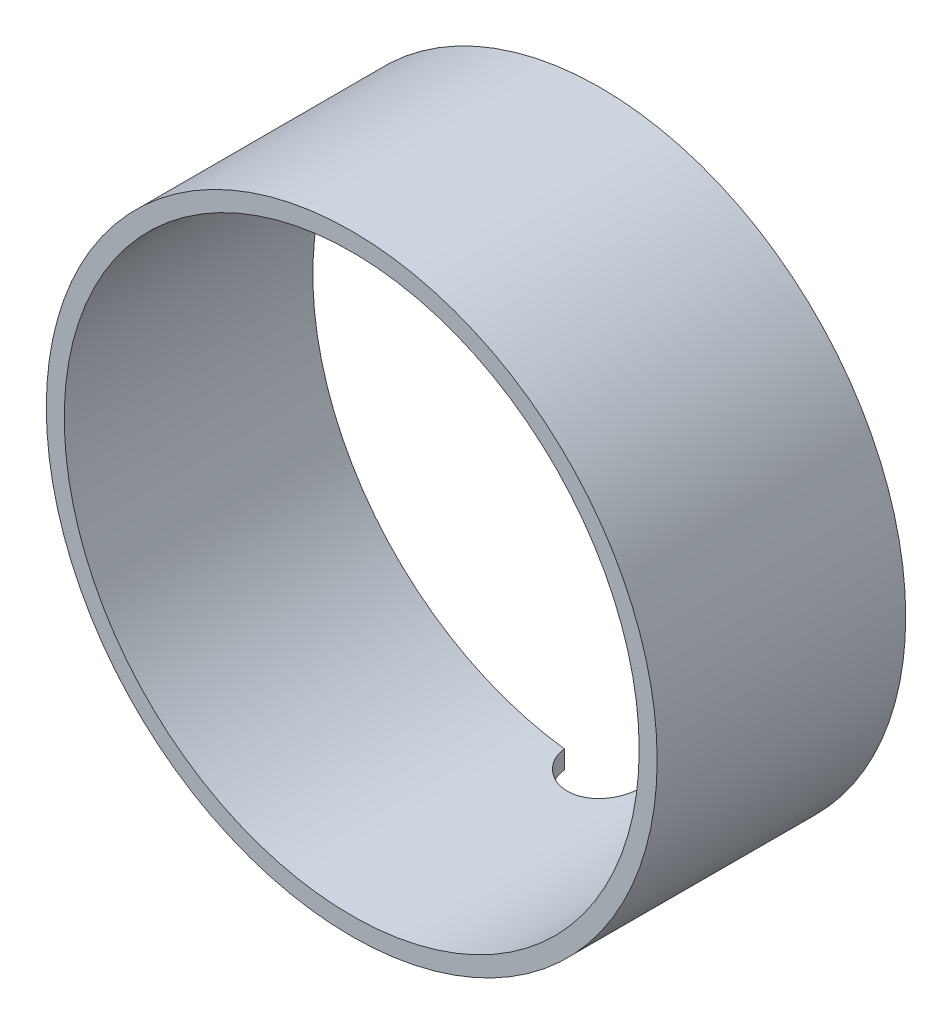
ISO-10303-21;
HEADER;
FILE_DESCRIPTION(('STEP AP214'),'2;1');
FILE_NAME('part.step','',(''),(''),'','','');
FILE_SCHEMA(('AUTOMOTIVE_DESIGN { 1 0 10303 214 1 1 1 1 }'));
ENDSEC;
DATA;
#1=APPLICATION_CONTEXT('core data for automotive mechanical design processes');
#2=APPLICATION_PROTOCOL_DEFINITION('international standard','automotive_design',2000,#1);
#3=PRODUCT_CONTEXT('',#1,'mechanical');
#4=PRODUCT('Part','Part','',(#3));
#5=PRODUCT_RELATED_PRODUCT_CATEGORY('part','',(#4));
#6=PRODUCT_DEFINITION_FORMATION('','',#4);
#7=PRODUCT_DEFINITION_CONTEXT('part definition',#1,'design');
#8=PRODUCT_DEFINITION('design','',#6,#7);
#9=PRODUCT_DEFINITION_SHAPE('','',#8);
#10=(LENGTH_UNIT() NAMED_UNIT(*) SI_UNIT(.MILLI.,.METRE.));
#11=(NAMED_UNIT(*) PLANE_ANGLE_UNIT() SI_UNIT($,.RADIAN.));
#12=(NAMED_UNIT(*) SI_UNIT($,.STERADIAN.) SOLID_ANGLE_UNIT());
#13=UNCERTAINTY_MEASURE_WITH_UNIT(LENGTH_MEASURE(1.E-05),#10,'distance_accuracy_value','');
#14=(GEOMETRIC_REPRESENTATION_CONTEXT(3) GLOBAL_UNCERTAINTY_ASSIGNED_CONTEXT((#13)) GLOBAL_UNIT_ASSIGNED_CONTEXT((#10,
#11,#12)) REPRESENTATION_CONTEXT('',''));
#15=CARTESIAN_POINT('',(0.,0.,0.));
#16=DIRECTION('',(0.,0.,1.));
#17=DIRECTION('',(1.,0.,0.));
#18=AXIS2_PLACEMENT_3D('',#15,#16,#17);
#19=CARTESIAN_POINT('',(0.,0.,-131.7625));
#20=DIRECTION('',(0.,0.,1.));
#21=DIRECTION('',(1.,0.,0.));
#22=AXIS2_PLACEMENT_3D('',#19,#20,#21);
#23=CYLINDRICAL_SURFACE('',#22,161.925);
#24=CARTESIAN_POINT('',(18.9837389296735,-160.808343319773,-131.7625));
#25=CARTESIAN_POINT('',(18.961466022444,-160.810971738573,-131.496149613923));
#26=CARTESIAN_POINT('',(18.9335891038871,-160.814259022241,-131.230304578021));
#27=CARTESIAN_POINT('',(18.8666815897224,-160.822122681522,-130.700048109082));
#28=CARTESIAN_POINT('',(18.8276512899163,-160.82669902295,-130.435636638214));
#29=CARTESIAN_POINT('',(18.69393558509,-160.842315908778,-129.645319234712));
#30=CARTESIAN_POINT('',(18.5826123346703,-160.855245879458,-129.122174657766));
#31=CARTESIAN_POINT('',(18.3165443588579,-160.885759799626,-128.087712827215));
#32=CARTESIAN_POINT('',(18.1618405119111,-160.903339366821,-127.57638492715));
#33=CARTESIAN_POINT('',(17.8981116761045,-160.932815096171,-126.820732928819));
#34=CARTESIAN_POINT('',(17.8049182703883,-160.943158609112,-126.57072781311));
#35=CARTESIAN_POINT('',(17.6081085271649,-160.964809656728,-126.074823316861));
#36=CARTESIAN_POINT('',(17.504489552965,-160.976117435163,-125.828924993383));
#37=CARTESIAN_POINT('',(17.1782615364766,-161.011368871332,-125.098064623704));
#38=CARTESIAN_POINT('',(16.9402794563965,-161.036640849761,-124.619931611093));
#39=CARTESIAN_POINT('',(16.4250924366937,-161.090002659423,-123.685450740371));
#40=CARTESIAN_POINT('',(16.1478873045073,-161.118092504489,-123.229102989228));
#41=CARTESIAN_POINT('',(15.704231908445,-161.161734863588,-122.563398558545));
#42=CARTESIAN_POINT('',(15.5516916252937,-161.176534877648,-122.344615838729));
#43=CARTESIAN_POINT('',(15.237618979362,-161.206530515819,-121.913718614954));
#44=CARTESIAN_POINT('',(15.0760889312637,-161.221726037563,-121.701602416308));
#45=CARTESIAN_POINT('',(14.5783394072319,-161.267754586245,-121.075692783361));
#46=CARTESIAN_POINT('',(14.2289326279456,-161.299032373303,-120.672296425714));
#47=CARTESIAN_POINT('',(13.4960251559106,-161.362011476133,-119.894645551329));
#48=CARTESIAN_POINT('',(13.1123864955449,-161.393714023792,-119.520521524876));
#49=CARTESIAN_POINT('',(12.3149385390816,-161.456520050128,-118.805879098529));
#50=CARTESIAN_POINT('',(11.9011289121974,-161.487623522231,-118.46536106718));
#51=CARTESIAN_POINT('',(11.0459352103613,-161.54837253449,-117.820131733959));
#52=CARTESIAN_POINT('',(10.6045360513213,-161.578017260992,-117.515440286592));
#53=CARTESIAN_POINT('',(9.92443025273123,-161.620738112077,-117.087158174939));
#54=CARTESIAN_POINT('',(9.69471932609914,-161.634687784202,-116.949185933724));
#55=CARTESIAN_POINT('',(9.22959200968354,-161.661914332914,-116.682998286136));
#56=CARTESIAN_POINT('',(8.99417414679003,-161.675191032997,-116.554785435048));
#57=CARTESIAN_POINT('',(8.27935597067805,-161.713900619609,-116.184836208362));
#58=CARTESIAN_POINT('',(7.79199213199093,-161.738174857803,-115.958167647385));
#59=CARTESIAN_POINT('',(6.79970679512866,-161.78292927983,-115.546771301093));
#60=CARTESIAN_POINT('',(6.29478543751167,-161.80340949403,-115.362043180109));
#61=CARTESIAN_POINT('',(5.52747056995496,-161.830832015282,-115.117568952115));
#62=CARTESIAN_POINT('',(5.27022457868346,-161.839418427419,-115.041555138066));
#63=CARTESIAN_POINT('',(4.75278805640906,-161.855440533475,-114.900463174734));
#64=CARTESIAN_POINT('',(4.49259827276679,-161.862876512726,-114.835382313495));
#65=CARTESIAN_POINT('',(3.70837274017756,-161.883373664349,-114.656746204713));
#66=CARTESIAN_POINT('',(3.18041108930672,-161.894633774818,-114.55971152609));
#67=CARTESIAN_POINT('',(2.21065567838321,-161.910504140314,-114.423514318599));
#68=CARTESIAN_POINT('',(1.76985031187699,-161.91593047618,-114.377220589214));
#69=CARTESIAN_POINT('',(0.886048368951091,-161.923178808356,-114.315461665421));
#70=CARTESIAN_POINT('',(0.443051760986435,-161.925000752625,-114.299996916126));
#71=CARTESIAN_POINT('',(-0.53292247015429,-161.924999094709,-114.300003709421));
#72=CARTESIAN_POINT('',(-1.06592473765367,-161.922361047003,-114.322386827642));
#73=CARTESIAN_POINT('',(-1.86249494154961,-161.914506692581,-114.38938983445));
#74=CARTESIAN_POINT('',(-2.12759754688475,-161.911237679581,-114.417307086566));
#75=CARTESIAN_POINT('',(-2.65644896022487,-161.903424432892,-114.484241899962));
#76=CARTESIAN_POINT('',(-2.92019741751931,-161.898879884296,-114.523262202428));
#77=CARTESIAN_POINT('',(-3.70936216580105,-161.883362745554,-114.657005951116));
#78=CARTESIAN_POINT('',(-4.23201394700511,-161.870513520969,-114.768354661067));
#79=CARTESIAN_POINT('',(-5.26599367138276,-161.840175754635,-115.034520094802));
#80=CARTESIAN_POINT('',(-5.7773215335646,-161.822687179717,-115.189337129374));
#81=CARTESIAN_POINT('',(-6.53279029299303,-161.79336158928,-115.453176564716));
#82=CARTESIAN_POINT('',(-6.782618314798,-161.78307454398,-115.546358810261));
#83=CARTESIAN_POINT('',(-7.27804417851695,-161.761544125925,-115.743081038116));
#84=CARTESIAN_POINT('',(-7.52364309670069,-161.750301000941,-115.84661833809));
#85=CARTESIAN_POINT('',(-8.25359905640003,-161.715246226125,-116.172558370586));
#86=CARTESIAN_POINT('',(-8.73114905979535,-161.690107850242,-116.410301030869));
#87=CARTESIAN_POINT('',(-9.66426854309286,-161.63701923804,-116.924768110766));
#88=CARTESIAN_POINT('',(-10.1198468392811,-161.609070143667,-117.201476717369));
#89=CARTESIAN_POINT('',(-11.0061480565138,-161.551129818619,-117.792020169497));
#90=CARTESIAN_POINT('',(-11.4368710804327,-161.521138596398,-118.105854861344));
#91=CARTESIAN_POINT('',(-12.2722808152047,-161.459818458525,-118.769891221167));
#92=CARTESIAN_POINT('',(-12.6768461814732,-161.428484293719,-119.12024507497));
#93=CARTESIAN_POINT('',(-13.4550588022724,-161.365484116355,-119.85371045559));
#94=CARTESIAN_POINT('',(-13.8287057278003,-161.333818100271,-120.236822330895));
#95=CARTESIAN_POINT('',(-14.5426280432676,-161.271032948516,-121.033324739558));
#96=CARTESIAN_POINT('',(-14.8828927706429,-161.239913990168,-121.446724874075));
#97=CARTESIAN_POINT('',(-15.3662349498228,-161.194325726944,-122.087100185477));
#98=CARTESIAN_POINT('',(-15.5228446165971,-161.179310853638,-122.303945357315));
#99=CARTESIAN_POINT('',(-15.826852562064,-161.1497430444,-122.744115080399));
#100=CARTESIAN_POINT('',(-15.9742484374426,-161.135190229472,-122.967441300095));
#101=CARTESIAN_POINT('',(-16.4030834382667,-161.092294256069,-123.647968154233));
#102=CARTESIAN_POINT('',(-16.6701610538481,-161.064809710126,-124.114380454066));
#103=CARTESIAN_POINT('',(-17.1640132652324,-161.012931135481,-125.068238230619));
#104=CARTESIAN_POINT('',(-17.3907881275467,-160.988537086343,-125.555683568226));
#105=CARTESIAN_POINT('',(-17.6993692735354,-160.954802949515,-126.299688492034));
#106=CARTESIAN_POINT('',(-17.7969383654419,-160.944037563291,-126.549742567509));
#107=CARTESIAN_POINT('',(-17.9814167057731,-160.92353117951,-127.053719401445));
#108=CARTESIAN_POINT('',(-18.0683285952124,-160.913789928244,-127.307641183823));
#109=CARTESIAN_POINT('',(-18.3128089343465,-160.886213465815,-128.074471694386));
#110=CARTESIAN_POINT('',(-18.4542297887638,-160.870013653529,-128.592705409864));
#111=CARTESIAN_POINT('',(-18.672885880359,-160.844767064809,-129.551870433903));
#112=CARTESIAN_POINT('',(-18.7568951658767,-160.834977616714,-129.991263100583));
#113=CARTESIAN_POINT('',(-18.893703203274,-160.818959006435,-130.874146729114));
#114=CARTESIAN_POINT('',(-18.9465569714287,-160.812723569014,-131.317629053673));
#115=CARTESIAN_POINT('',(-18.9837389296735,-160.808343319773,-131.7625));
#116=B_SPLINE_CURVE_WITH_KNOTS('',3,(#24,#25,#26,#27,#28,#29,#30,#31,#32,#33,#34,#35,#36,#37,
#38,#39,#40,#41,#42,#43,#44,#45,#46,#47,#48,#49,#50,#51,#52,#53,#54,#55,#56,#57,#58,#59,#60,#61,
#62,#63,#64,#65,#66,#67,#68,#69,#70,#71,#72,#73,#74,#75,#76,#77,#78,#79,#80,#81,#82,#83,#84,#85,
#86,#87,#88,#89,#90,#91,#92,#93,#94,#95,#96,#97,#98,#99,#100,#101,#102,#103,#104,#105,#106,#107,
#108,#109,#110,#111,#112,#113,#114,#115),.UNSPECIFIED.,.F.,.F.,(4,2,2,2,2,2,2,2,2,2,2,2,2,2,2,2,
2,2,2,2,2,2,2,2,2,2,2,2,2,2,2,2,2,2,2,2,2,2,2,2,2,2,2,2,2,4),(0.,0.801758833603154,
1.60349640553103,3.20650446432167,4.80800702207118,5.60883101112908,6.40985804520766,
8.01189446808052,9.61393875634906,10.4150943968225,11.2160447018288,12.8177945407123,
14.4263198978507,16.0348628930915,17.6442931564504,18.4490609964855,19.254038827941,
20.8661214976263,22.4781912646229,23.2831149769194,24.0878387293384,25.6964392408233,
27.0251920818512,28.3539641075144,29.9522705189633,30.7518367264337,31.5516005069795,
33.1531803581565,34.7547716605725,35.5550796006935,36.3551807661364,37.9552760920082,
39.5547239347126,41.1541651569321,42.7605605257411,44.3669729859902,45.973896889123,
46.7774122942631,47.581136420258,49.1936002798929,50.8060534763329,51.6117333128844,
52.4172130846446,54.0273307526308,55.3686407587724,56.7075750484434),.UNSPECIFIED.);
#117=CARTESIAN_POINT('',(18.9837389296735,-160.808343319773,-131.7625));
#118=VERTEX_POINT('',#117);
#119=CARTESIAN_POINT('',(-18.9837389296735,-160.808343319773,-131.7625));
#120=VERTEX_POINT('',#119);
#121=EDGE_CURVE('E72',#118,#120,#116,.T.);
#122=ORIENTED_EDGE('',*,*,#121,.F.);
#123=CARTESIAN_POINT('',(0.,0.,-131.7625));
#124=DIRECTION('',(0.,0.,1.));
#125=DIRECTION('',(1.,0.,0.));
#126=AXIS2_PLACEMENT_3D('',#123,#124,#125);
#127=CIRCLE('',#126,161.925);
#128=EDGE_CURVE('E47',#118,#120,#127,.T.);
#129=ORIENTED_EDGE('',*,*,#128,.T.);
#130=EDGE_LOOP('',(#122,#129));
#131=FACE_BOUND('',#130,.T.);
#132=CARTESIAN_POINT('',(0.,0.,0.));
#133=DIRECTION('',(0.,0.,1.));
#134=DIRECTION('',(1.,0.,0.));
#135=AXIS2_PLACEMENT_3D('',#132,#133,#134);
#136=CIRCLE('',#135,161.925);
#137=CARTESIAN_POINT('',(161.925,0.,0.));
#138=VERTEX_POINT('',#137);
#139=EDGE_CURVE('E76',#138,#138,#136,.T.);
#140=ORIENTED_EDGE('',*,*,#139,.F.);
#141=EDGE_LOOP('',(#140));
#142=FACE_BOUND('',#141,.T.);
#143=ADVANCED_FACE('F34',(#131,#142),#23,.T.);
#144=CARTESIAN_POINT('',(0.,0.,-131.7625));
#145=DIRECTION('',(0.,0.,1.));
#146=DIRECTION('',(1.,0.,0.));
#147=AXIS2_PLACEMENT_3D('',#144,#145,#146);
#148=PLANE('',#147);
#149=ORIENTED_EDGE('',*,*,#128,.F.);
#150=DIRECTION('',(0.,1.,0.));
#151=VECTOR('',#150,1.);
#152=CARTESIAN_POINT('',(18.9837389296735,-161.925,-131.7625));
#153=LINE('',#152,#151);
#154=CARTESIAN_POINT('',(18.9837389296735,-151.213020789382,-131.7625));
#155=VERTEX_POINT('',#154);
#156=EDGE_CURVE('E58',#118,#155,#153,.T.);
#157=ORIENTED_EDGE('',*,*,#156,.T.);
#158=CARTESIAN_POINT('',(0.,0.,-131.7625));
#159=DIRECTION('',(0.,0.,1.));
#160=DIRECTION('',(1.,0.,0.));
#161=AXIS2_PLACEMENT_3D('',#158,#159,#160);
#162=CIRCLE('',#161,152.4);
#163=CARTESIAN_POINT('',(-18.9837389296735,-151.213020789382,-131.7625));
#164=VERTEX_POINT('',#163);
#165=EDGE_CURVE('E70',#155,#164,#162,.T.);
#166=ORIENTED_EDGE('',*,*,#165,.T.);
#167=DIRECTION('',(0.,1.,0.));
#168=VECTOR('',#167,1.);
#169=CARTESIAN_POINT('',(-18.9837389296735,-161.925,-131.7625));
#170=LINE('',#169,#168);
#171=EDGE_CURVE('E54',#164,#120,#170,.F.);
#172=ORIENTED_EDGE('',*,*,#171,.T.);
#173=EDGE_LOOP('',(#149,#157,#166,#172));
#174=FACE_BOUND('',#173,.T.);
#175=ADVANCED_FACE('F69',(#174),#148,.F.);
#176=CARTESIAN_POINT('',(0.,0.,0.));
#177=DIRECTION('',(0.,0.,1.));
#178=DIRECTION('',(1.,0.,0.));
#179=AXIS2_PLACEMENT_3D('',#176,#177,#178);
#180=PLANE('',#179);
#181=CARTESIAN_POINT('',(0.,0.,0.));
#182=DIRECTION('',(0.,0.,1.));
#183=DIRECTION('',(1.,0.,0.));
#184=AXIS2_PLACEMENT_3D('',#181,#182,#183);
#185=CIRCLE('',#184,152.4);
#186=CARTESIAN_POINT('',(152.4,0.,0.));
#187=VERTEX_POINT('',#186);
#188=EDGE_CURVE('E77',#187,#187,#185,.T.);
#189=ORIENTED_EDGE('',*,*,#188,.F.);
#190=EDGE_LOOP('',(#189));
#191=FACE_BOUND('',#190,.T.);
#192=ORIENTED_EDGE('',*,*,#139,.T.);
#193=EDGE_LOOP('',(#192));
#194=FACE_BOUND('',#193,.T.);
#195=ADVANCED_FACE('F96',(#191,#194),#180,.T.);
#196=CARTESIAN_POINT('',(0.,0.,-131.7625));
#197=DIRECTION('',(0.,0.,1.));
#198=DIRECTION('',(1.,0.,0.));
#199=AXIS2_PLACEMENT_3D('',#196,#197,#198);
#200=CYLINDRICAL_SURFACE('',#199,152.4);
#201=ORIENTED_EDGE('',*,*,#165,.F.);
#202=CARTESIAN_POINT('',(18.9837389296735,-151.213020789382,-131.7625));
#203=CARTESIAN_POINT('',(18.9614724762539,-151.215815185605,-131.496226631093));
#204=CARTESIAN_POINT('',(18.9336052989775,-151.219309837398,-131.230459227382));
#205=CARTESIAN_POINT('',(18.866724206872,-151.227669134534,-130.700359579921));
#206=CARTESIAN_POINT('',(18.8277105914752,-151.232533743075,-130.436027297813));
#207=CARTESIAN_POINT('',(18.6940562523511,-151.249133739892,-129.645952281916));
#208=CARTESIAN_POINT('',(18.5827888027986,-151.262876988022,-129.122973427615));
#209=CARTESIAN_POINT('',(18.3168742806415,-151.295307274804,-128.088883202709));
#210=CARTESIAN_POINT('',(18.1622708372557,-151.31398934015,-127.577760453274));
#211=CARTESIAN_POINT('',(17.8987243413142,-151.345311854285,-126.822417401763));
#212=CARTESIAN_POINT('',(17.8055969429478,-151.356303176459,-126.57251532989));
#213=CARTESIAN_POINT('',(17.6089302040455,-151.379309639344,-126.076816822662));
#214=CARTESIAN_POINT('',(17.5053882333912,-151.391325038559,-125.831021442789));
#215=CARTESIAN_POINT('',(17.1794189274346,-151.428780321431,-125.100492573783));
#216=CARTESIAN_POINT('',(16.9416375116178,-151.455630575426,-124.622585742034));
#217=CARTESIAN_POINT('',(16.4269011964202,-151.512322555837,-123.688541957298));
#218=CARTESIAN_POINT('',(16.1499460833568,-151.54216429857,-123.232405123079));
#219=CARTESIAN_POINT('',(15.7066858894847,-151.588528816411,-122.566975462932));
#220=CARTESIAN_POINT('',(15.5542724944452,-151.604252832943,-122.34826706048));
#221=CARTESIAN_POINT('',(15.240462883641,-151.636120918627,-121.917511914575));
#222=CARTESIAN_POINT('',(15.0790689769868,-151.652264879236,-121.705463480417));
#223=CARTESIAN_POINT('',(14.5817395723279,-151.701166204721,-121.079744319878));
#224=CARTESIAN_POINT('',(14.2326291635824,-151.734395891975,-120.676458876018));
#225=CARTESIAN_POINT('',(13.5000799064304,-151.801329930772,-119.898708960938));
#226=CARTESIAN_POINT('',(13.1164794037312,-151.835035819023,-119.524397335463));
#227=CARTESIAN_POINT('',(12.319068408972,-151.901812303606,-118.809374373358));
#228=CARTESIAN_POINT('',(11.9052577679215,-151.934882896803,-118.468663202457));
#229=CARTESIAN_POINT('',(11.050272139312,-151.999458115684,-117.823218692539));
#230=CARTESIAN_POINT('',(10.60909351365,-152.030962532164,-117.518490152493));
#231=CARTESIAN_POINT('',(9.70250295663328,-152.09151123265,-116.947226098237));
#232=CARTESIAN_POINT('',(9.23709105998561,-152.120555520178,-116.680690529329));
#233=CARTESIAN_POINT('',(8.28479691965433,-152.175391613213,-116.187468817975));
#234=CARTESIAN_POINT('',(7.79789246063054,-152.201179941737,-115.960825175369));
#235=CARTESIAN_POINT('',(6.80651887352654,-152.248735758011,-115.549386965328));
#236=CARTESIAN_POINT('',(6.30204971893161,-152.270503239691,-115.36459246107));
#237=CARTESIAN_POINT('',(5.27918914055877,-152.309395812635,-115.038232628447));
#238=CARTESIAN_POINT('',(4.76079894069558,-152.326521310555,-114.89666351323));
#239=CARTESIAN_POINT('',(3.7137771509815,-152.355643510537,-114.657790857901));
#240=CARTESIAN_POINT('',(3.18514562205441,-152.367640243101,-114.560487054547));
#241=CARTESIAN_POINT('',(2.12487706555655,-152.386102425927,-114.411358061817));
#242=CARTESIAN_POINT('',(1.5932811607262,-152.392602914053,-114.359244733472));
#243=CARTESIAN_POINT('',(0.527552895721415,-152.400018490904,-114.299829109229));
#244=CARTESIAN_POINT('',(-0.00657945392054096,-152.400933602802,-114.292526627419));
#245=CARTESIAN_POINT('',(-1.07354014533464,-152.397152581565,-114.32278692709));
#246=CARTESIAN_POINT('',(-1.60636851373741,-152.392456563997,-114.360348784535));
#247=CARTESIAN_POINT('',(-2.66691526143836,-152.377586330276,-114.480054733505));
#248=CARTESIAN_POINT('',(-3.19463364685778,-152.367412120687,-114.562198771618));
#249=CARTESIAN_POINT('',(-4.23912657252457,-152.341923497838,-114.770044894901));
#250=CARTESIAN_POINT('',(-4.75593606548546,-152.326629514971,-114.895573916418));
#251=CARTESIAN_POINT('',(-5.7771045055438,-152.291319818828,-115.189332797766));
#252=CARTESIAN_POINT('',(-6.28146349306982,-152.271304120887,-115.357562518923));
#253=CARTESIAN_POINT('',(-7.27423080110534,-152.22710827644,-115.735511859728));
#254=CARTESIAN_POINT('',(-7.76263820650699,-152.202927891513,-115.945233854844));
#255=CARTESIAN_POINT('',(-8.72007970781154,-152.151076534514,-116.404656827178));
#256=CARTESIAN_POINT('',(-9.18911371251129,-152.123405546013,-116.654357992577));
#257=CARTESIAN_POINT('',(-10.1066965942031,-152.065206518027,-117.193218798798));
#258=CARTESIAN_POINT('',(-10.5551401941323,-152.034665804179,-117.482556342294));
#259=CARTESIAN_POINT('',(-11.4260953690205,-151.9716915029,-118.097750807081));
#260=CARTESIAN_POINT('',(-11.8486068280679,-151.939257907011,-118.42360789159));
#261=CARTESIAN_POINT('',(-12.6647691932287,-151.87340541703,-119.109554843474));
#262=CARTESIAN_POINT('',(-13.0584204846833,-151.839986536102,-119.469644253632));
#263=CARTESIAN_POINT('',(-13.8141428080571,-151.773098396152,-120.221554549765));
#264=CARTESIAN_POINT('',(-14.1762139720234,-151.739629137342,-120.613375303047));
#265=CARTESIAN_POINT('',(-14.8684029879248,-151.6733736011,-121.428558338662));
#266=CARTESIAN_POINT('',(-15.1983089877332,-151.640592839395,-121.852100987695));
#267=CARTESIAN_POINT('',(-15.8212786974706,-151.576862429668,-122.725621104279));
#268=CARTESIAN_POINT('',(-16.1143411031333,-151.545912846489,-123.175599506831));
#269=CARTESIAN_POINT('',(-16.6614724182919,-151.486735638786,-124.098746115249));
#270=CARTESIAN_POINT('',(-16.9155469660842,-151.458507620899,-124.571910954885));
#271=CARTESIAN_POINT('',(-17.3828951978756,-151.405582137396,-125.538126262135));
#272=CARTESIAN_POINT('',(-17.5961738405554,-151.380884242791,-126.031174304143));
#273=CARTESIAN_POINT('',(-17.9487788274871,-151.339444383567,-126.951168868218));
#274=CARTESIAN_POINT('',(-18.0944988141852,-151.322061993556,-127.37565056582));
#275=CARTESIAN_POINT('',(-18.3556350544075,-151.290607504905,-128.233914773284));
#276=CARTESIAN_POINT('',(-18.4710551654521,-151.276534984904,-128.667696091584));
#277=CARTESIAN_POINT('',(-18.6709569512953,-151.2519941421,-129.542254674141));
#278=CARTESIAN_POINT('',(-18.7554502625117,-151.241524463792,-129.983029241877));
#279=CARTESIAN_POINT('',(-18.8931627942431,-151.224377638832,-130.86958373433));
#280=CARTESIAN_POINT('',(-18.9463768481754,-151.217701118724,-131.315364473562));
#281=CARTESIAN_POINT('',(-18.9837389296735,-151.213020789382,-131.7625));
#282=B_SPLINE_CURVE_WITH_KNOTS('',3,(#202,#203,#204,#205,#206,#207,#208,#209,#210,#211,#212,
#213,#214,#215,#216,#217,#218,#219,#220,#221,#222,#223,#224,#225,#226,#227,#228,#229,#230,#231,
#232,#233,#234,#235,#236,#237,#238,#239,#240,#241,#242,#243,#244,#245,#246,#247,#248,#249,#250,
#251,#252,#253,#254,#255,#256,#257,#258,#259,#260,#261,#262,#263,#264,#265,#266,#267,#268,#269,
#270,#271,#272,#273,#274,#275,#276,#277,#278,#279,#280,#281),.UNSPECIFIED.,.F.,.F.,(4,2,2,2,2,2,
2,2,2,2,2,2,2,2,2,2,2,2,2,2,2,2,2,2,2,2,2,2,2,2,2,2,2,2,2,2,2,2,2,4),(0.,0.801531912424057,
1.60304229492018,3.20558907878383,4.80652823181075,5.60707145430104,6.40781735773749,
8.00921212897076,9.6106156357434,10.4115300163919,11.2122394053918,12.8135111003181,
14.4227237491503,16.0319443348411,17.6413792990605,19.2508119583013,20.8619490219119,
22.4730885177136,24.0840868256313,25.6950755529541,27.2957152936889,28.8963483936339,
30.4969485271214,32.097546743015,33.6918324545974,35.2861129886266,36.8804848230119,
38.4748641622831,40.0766496345966,41.6784422660634,43.2802135064902,44.8819780490507,
46.4936657771333,48.1054105430391,49.71692200357,51.3282374626676,52.6745498617277,
54.0206907766248,55.3663246749715,56.7121807773331),.UNSPECIFIED.);
#283=EDGE_CURVE('E11',#155,#164,#282,.T.);
#284=ORIENTED_EDGE('',*,*,#283,.T.);
#285=EDGE_LOOP('',(#201,#284));
#286=FACE_BOUND('',#285,.T.);
#287=ORIENTED_EDGE('',*,*,#188,.T.);
#288=EDGE_LOOP('',(#287));
#289=FACE_BOUND('',#288,.T.);
#290=ADVANCED_FACE('F74',(#286,#289),#200,.F.);
#291=CARTESIAN_POINT('',(0.,-161.925,-133.35));
#292=DIRECTION('',(0.,1.,0.));
#293=DIRECTION('',(0.,0.,1.));
#294=AXIS2_PLACEMENT_3D('',#291,#292,#293);
#295=CYLINDRICAL_SURFACE('',#294,19.05);
#296=ORIENTED_EDGE('',*,*,#121,.T.);
#297=ORIENTED_EDGE('',*,*,#171,.F.);
#298=ORIENTED_EDGE('',*,*,#283,.F.);
#299=ORIENTED_EDGE('',*,*,#156,.F.);
#300=EDGE_LOOP('',(#296,#297,#298,#299));
#301=FACE_BOUND('',#300,.T.);
#302=ADVANCED_FACE('F63',(#301),#295,.F.);
#303=CLOSED_SHELL('',(#143,#175,#195,#290,#302));
#304=MANIFOLD_SOLID_BREP('B2',#303);
#305=ADVANCED_BREP_SHAPE_REPRESENTATION('',(#18,#304),#14);
#306=SHAPE_DEFINITION_REPRESENTATION(#9,#305);
ENDSEC;
END-ISO-10303-21;
